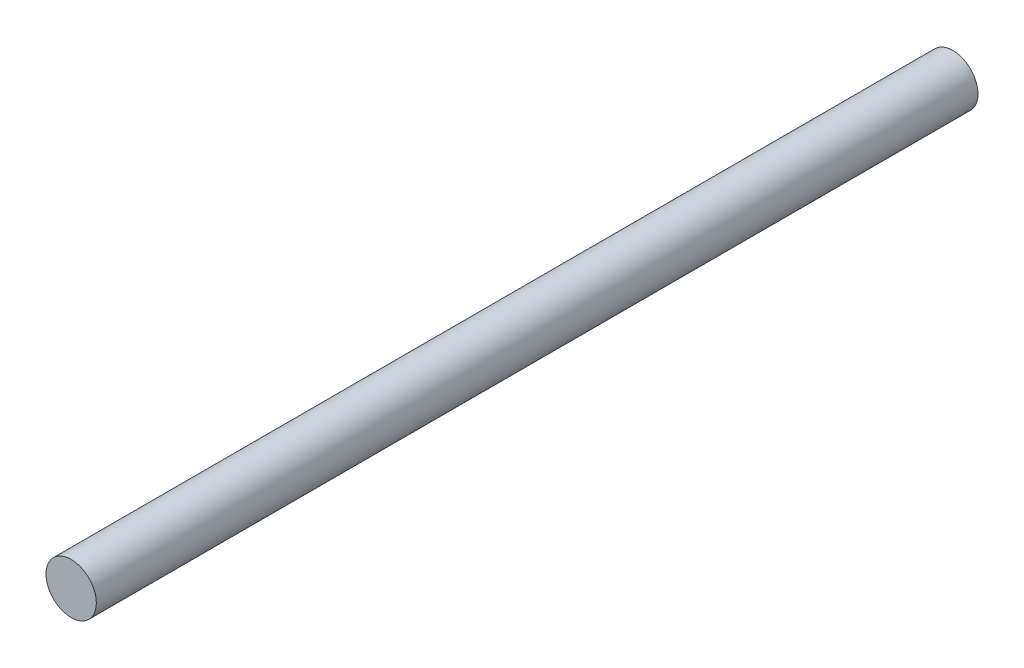
ISO-10303-21;
HEADER;
FILE_DESCRIPTION(('STEP AP214'),'2;1');
FILE_NAME('part.step','',(''),(''),'','','');
FILE_SCHEMA(('AUTOMOTIVE_DESIGN { 1 0 10303 214 1 1 1 1 }'));
ENDSEC;
DATA;
#1=APPLICATION_CONTEXT('core data for automotive mechanical design processes');
#2=APPLICATION_PROTOCOL_DEFINITION('international standard','automotive_design',2000,#1);
#3=PRODUCT_CONTEXT('',#1,'mechanical');
#4=PRODUCT('Part','Part','',(#3));
#5=PRODUCT_RELATED_PRODUCT_CATEGORY('part','',(#4));
#6=PRODUCT_DEFINITION_FORMATION('','',#4);
#7=PRODUCT_DEFINITION_CONTEXT('part definition',#1,'design');
#8=PRODUCT_DEFINITION('design','',#6,#7);
#9=PRODUCT_DEFINITION_SHAPE('','',#8);
#10=(LENGTH_UNIT() NAMED_UNIT(*) SI_UNIT(.MILLI.,.METRE.));
#11=(NAMED_UNIT(*) PLANE_ANGLE_UNIT() SI_UNIT($,.RADIAN.));
#12=(NAMED_UNIT(*) SI_UNIT($,.STERADIAN.) SOLID_ANGLE_UNIT());
#13=UNCERTAINTY_MEASURE_WITH_UNIT(LENGTH_MEASURE(1.E-05),#10,'distance_accuracy_value','');
#14=(GEOMETRIC_REPRESENTATION_CONTEXT(3) GLOBAL_UNCERTAINTY_ASSIGNED_CONTEXT((#13)) GLOBAL_UNIT_ASSIGNED_CONTEXT((#10,
#11,#12)) REPRESENTATION_CONTEXT('',''));
#15=CARTESIAN_POINT('',(0.,0.,0.));
#16=DIRECTION('',(0.,0.,1.));
#17=DIRECTION('',(1.,0.,0.));
#18=AXIS2_PLACEMENT_3D('',#15,#16,#17);
#19=CARTESIAN_POINT('',(0.,0.,70.));
#20=DIRECTION('',(0.,0.,-1.));
#21=DIRECTION('',(-1.,0.,0.));
#22=AXIS2_PLACEMENT_3D('',#19,#20,#21);
#23=CYLINDRICAL_SURFACE('',#22,2.);
#24=CARTESIAN_POINT('',(0.,0.,70.));
#25=DIRECTION('',(0.,0.,1.));
#26=DIRECTION('',(1.,0.,0.));
#27=AXIS2_PLACEMENT_3D('',#24,#25,#26);
#28=CIRCLE('',#27,2.);
#29=CARTESIAN_POINT('',(2.,0.,70.));
#30=VERTEX_POINT('',#29);
#31=EDGE_CURVE('E10',#30,#30,#28,.T.);
#32=ORIENTED_EDGE('',*,*,#31,.F.);
#33=EDGE_LOOP('',(#32));
#34=FACE_BOUND('',#33,.T.);
#35=CARTESIAN_POINT('',(0.,0.,0.));
#36=DIRECTION('',(0.,0.,1.));
#37=DIRECTION('',(1.,0.,0.));
#38=AXIS2_PLACEMENT_3D('',#35,#36,#37);
#39=CIRCLE('',#38,2.);
#40=CARTESIAN_POINT('',(2.,0.,0.));
#41=VERTEX_POINT('',#40);
#42=EDGE_CURVE('E40',#41,#41,#39,.T.);
#43=ORIENTED_EDGE('',*,*,#42,.T.);
#44=EDGE_LOOP('',(#43));
#45=FACE_BOUND('',#44,.T.);
#46=ADVANCED_FACE('F37',(#34,#45),#23,.T.);
#47=CARTESIAN_POINT('',(0.,0.,70.));
#48=DIRECTION('',(0.,0.,1.));
#49=DIRECTION('',(1.,0.,0.));
#50=AXIS2_PLACEMENT_3D('',#47,#48,#49);
#51=PLANE('',#50);
#52=ORIENTED_EDGE('',*,*,#31,.T.);
#53=EDGE_LOOP('',(#52));
#54=FACE_BOUND('',#53,.T.);
#55=ADVANCED_FACE('F54',(#54),#51,.T.);
#56=CARTESIAN_POINT('',(0.,0.,0.));
#57=DIRECTION('',(0.,0.,1.));
#58=DIRECTION('',(1.,0.,0.));
#59=AXIS2_PLACEMENT_3D('',#56,#57,#58);
#60=PLANE('',#59);
#61=ORIENTED_EDGE('',*,*,#42,.F.);
#62=EDGE_LOOP('',(#61));
#63=FACE_BOUND('',#62,.T.);
#64=ADVANCED_FACE('F52',(#63),#60,.F.);
#65=CLOSED_SHELL('',(#46,#55,#64));
#66=MANIFOLD_SOLID_BREP('B2',#65);
#67=ADVANCED_BREP_SHAPE_REPRESENTATION('',(#18,#66),#14);
#68=SHAPE_DEFINITION_REPRESENTATION(#9,#67);
ENDSEC;
END-ISO-10303-21;
